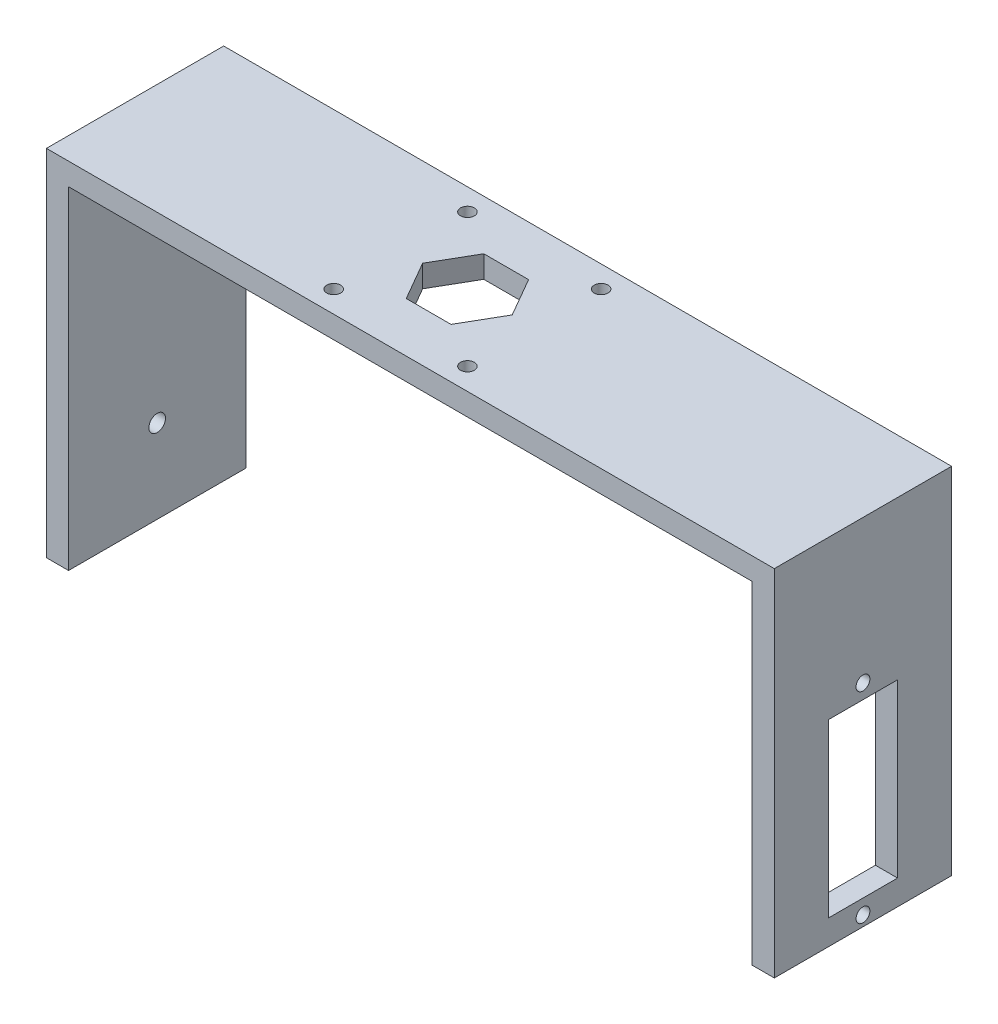
ISO-10303-21;
HEADER;
FILE_DESCRIPTION(('STEP AP214'),'2;1');
FILE_NAME('part.step','',(''),(''),'','','');
FILE_SCHEMA(('AUTOMOTIVE_DESIGN { 1 0 10303 214 1 1 1 1 }'));
ENDSEC;
DATA;
#1=APPLICATION_CONTEXT('core data for automotive mechanical design processes');
#2=APPLICATION_PROTOCOL_DEFINITION('international standard','automotive_design',2000,#1);
#3=PRODUCT_CONTEXT('',#1,'mechanical');
#4=PRODUCT('Part','Part','',(#3));
#5=PRODUCT_RELATED_PRODUCT_CATEGORY('part','',(#4));
#6=PRODUCT_DEFINITION_FORMATION('','',#4);
#7=PRODUCT_DEFINITION_CONTEXT('part definition',#1,'design');
#8=PRODUCT_DEFINITION('design','',#6,#7);
#9=PRODUCT_DEFINITION_SHAPE('','',#8);
#10=(LENGTH_UNIT() NAMED_UNIT(*) SI_UNIT(.MILLI.,.METRE.));
#11=(NAMED_UNIT(*) PLANE_ANGLE_UNIT() SI_UNIT($,.RADIAN.));
#12=(NAMED_UNIT(*) SI_UNIT($,.STERADIAN.) SOLID_ANGLE_UNIT());
#13=UNCERTAINTY_MEASURE_WITH_UNIT(LENGTH_MEASURE(1.E-05),#10,'distance_accuracy_value','');
#14=(GEOMETRIC_REPRESENTATION_CONTEXT(3) GLOBAL_UNCERTAINTY_ASSIGNED_CONTEXT((#13)) GLOBAL_UNIT_ASSIGNED_CONTEXT((#10,
#11,#12)) REPRESENTATION_CONTEXT('',''));
#15=CARTESIAN_POINT('',(0.,0.,0.));
#16=DIRECTION('',(0.,0.,1.));
#17=DIRECTION('',(1.,0.,0.));
#18=AXIS2_PLACEMENT_3D('',#15,#16,#17);
#19=CARTESIAN_POINT('',(67.4,0.,16.));
#20=DIRECTION('',(1.,0.,0.));
#21=DIRECTION('',(0.,0.,-1.));
#22=AXIS2_PLACEMENT_3D('',#19,#20,#21);
#23=PLANE('',#22);
#24=CARTESIAN_POINT('',(67.4,1.87500000000002,0.));
#25=DIRECTION('',(1.,0.,0.));
#26=DIRECTION('',(0.,0.,-1.));
#27=AXIS2_PLACEMENT_3D('',#24,#25,#26);
#28=CIRCLE('',#27,1.25);
#29=CARTESIAN_POINT('',(67.4,1.87500000000002,-1.25));
#30=VERTEX_POINT('',#29);
#31=EDGE_CURVE('E212',#30,#30,#28,.F.);
#32=ORIENTED_EDGE('',*,*,#31,.F.);
#33=EDGE_LOOP('',(#32));
#34=FACE_BOUND('',#33,.T.);
#35=DIRECTION('',(0.,0.,-1.));
#36=VECTOR('',#35,1.);
#37=CARTESIAN_POINT('',(67.4,4.50000000000002,-6.25));
#38=LINE('',#37,#36);
#39=CARTESIAN_POINT('',(67.4,4.50000000000002,6.25));
#40=VERTEX_POINT('',#39);
#41=CARTESIAN_POINT('',(67.4,4.50000000000002,-6.25));
#42=VERTEX_POINT('',#41);
#43=EDGE_CURVE('E222',#40,#42,#38,.T.);
#44=ORIENTED_EDGE('',*,*,#43,.T.);
#45=DIRECTION('',(0.,-1.,0.));
#46=VECTOR('',#45,1.);
#47=CARTESIAN_POINT('',(67.4,4.50000000000006,-6.25));
#48=LINE('',#47,#46);
#49=CARTESIAN_POINT('',(67.4,35.5,-6.25));
#50=VERTEX_POINT('',#49);
#51=EDGE_CURVE('E225',#50,#42,#48,.T.);
#52=ORIENTED_EDGE('',*,*,#51,.F.);
#53=DIRECTION('',(0.,0.,-1.));
#54=VECTOR('',#53,1.);
#55=CARTESIAN_POINT('',(67.4,35.5,-6.25));
#56=LINE('',#55,#54);
#57=CARTESIAN_POINT('',(67.4,35.5,6.25));
#58=VERTEX_POINT('',#57);
#59=EDGE_CURVE('E229',#58,#50,#56,.T.);
#60=ORIENTED_EDGE('',*,*,#59,.F.);
#61=DIRECTION('',(0.,-1.,0.));
#62=VECTOR('',#61,1.);
#63=CARTESIAN_POINT('',(67.4,4.50000000000005,6.25));
#64=LINE('',#63,#62);
#65=EDGE_CURVE('E245',#58,#40,#64,.T.);
#66=ORIENTED_EDGE('',*,*,#65,.T.);
#67=EDGE_LOOP('',(#44,#52,#60,#66));
#68=FACE_BOUND('',#67,.T.);
#69=DIRECTION('',(0.,-1.,0.));
#70=VECTOR('',#69,1.);
#71=CARTESIAN_POINT('',(67.4,0.,-16.));
#72=LINE('',#71,#70);
#73=CARTESIAN_POINT('',(67.4,60.,-16.));
#74=VERTEX_POINT('',#73);
#75=CARTESIAN_POINT('',(67.4,0.,-16.));
#76=VERTEX_POINT('',#75);
#77=EDGE_CURVE('E282',#74,#76,#72,.T.);
#78=ORIENTED_EDGE('',*,*,#77,.T.);
#79=DIRECTION('',(0.,0.,-1.));
#80=VECTOR('',#79,1.);
#81=CARTESIAN_POINT('',(67.4,0.,16.));
#82=LINE('',#81,#80);
#83=CARTESIAN_POINT('',(67.4,0.,16.));
#84=VERTEX_POINT('',#83);
#85=EDGE_CURVE('E302',#84,#76,#82,.T.);
#86=ORIENTED_EDGE('',*,*,#85,.F.);
#87=DIRECTION('',(0.,-1.,0.));
#88=VECTOR('',#87,1.);
#89=CARTESIAN_POINT('',(67.4,0.,16.));
#90=LINE('',#89,#88);
#91=CARTESIAN_POINT('',(67.4,60.,16.));
#92=VERTEX_POINT('',#91);
#93=EDGE_CURVE('E265',#92,#84,#90,.T.);
#94=ORIENTED_EDGE('',*,*,#93,.F.);
#95=DIRECTION('',(0.,0.,-1.));
#96=VECTOR('',#95,1.);
#97=CARTESIAN_POINT('',(67.4,60.,16.));
#98=LINE('',#97,#96);
#99=EDGE_CURVE('E305',#92,#74,#98,.T.);
#100=ORIENTED_EDGE('',*,*,#99,.T.);
#101=EDGE_LOOP('',(#78,#86,#94,#100));
#102=FACE_BOUND('',#101,.T.);
#103=CARTESIAN_POINT('',(67.4,38.125,0.));
#104=DIRECTION('',(1.,0.,0.));
#105=DIRECTION('',(0.,0.,-1.));
#106=AXIS2_PLACEMENT_3D('',#103,#104,#105);
#107=CIRCLE('',#106,1.25);
#108=CARTESIAN_POINT('',(67.4,38.125,-1.25));
#109=VERTEX_POINT('',#108);
#110=EDGE_CURVE('E216',#109,#109,#107,.T.);
#111=ORIENTED_EDGE('',*,*,#110,.T.);
#112=EDGE_LOOP('',(#111));
#113=FACE_BOUND('',#112,.T.);
#114=ADVANCED_FACE('F33',(#34,#68,#102,#113),#23,.F.);
#115=CARTESIAN_POINT('',(71.4,64.,16.));
#116=DIRECTION('',(-1.,0.,0.));
#117=DIRECTION('',(0.,-1.,0.));
#118=AXIS2_PLACEMENT_3D('',#115,#116,#117);
#119=PLANE('',#118);
#120=CARTESIAN_POINT('',(71.4,1.87500000000002,0.));
#121=DIRECTION('',(1.,0.,0.));
#122=DIRECTION('',(0.,1.,0.));
#123=AXIS2_PLACEMENT_3D('',#120,#121,#122);
#124=CIRCLE('',#123,1.25);
#125=CARTESIAN_POINT('',(71.4,3.12500000000002,0.));
#126=VERTEX_POINT('',#125);
#127=EDGE_CURVE('E213',#126,#126,#124,.T.);
#128=ORIENTED_EDGE('',*,*,#127,.F.);
#129=EDGE_LOOP('',(#128));
#130=FACE_BOUND('',#129,.T.);
#131=DIRECTION('',(0.,0.,1.));
#132=VECTOR('',#131,1.);
#133=CARTESIAN_POINT('',(71.4,4.50000000000002,-6.25));
#134=LINE('',#133,#132);
#135=CARTESIAN_POINT('',(71.4,4.50000000000002,-6.25));
#136=VERTEX_POINT('',#135);
#137=CARTESIAN_POINT('',(71.4,4.50000000000002,6.25));
#138=VERTEX_POINT('',#137);
#139=EDGE_CURVE('E242',#136,#138,#134,.T.);
#140=ORIENTED_EDGE('',*,*,#139,.T.);
#141=DIRECTION('',(0.,1.,0.));
#142=VECTOR('',#141,1.);
#143=CARTESIAN_POINT('',(71.4,4.50000000000002,6.25));
#144=LINE('',#143,#142);
#145=CARTESIAN_POINT('',(71.4,35.5,6.25));
#146=VERTEX_POINT('',#145);
#147=EDGE_CURVE('E237',#138,#146,#144,.T.);
#148=ORIENTED_EDGE('',*,*,#147,.T.);
#149=DIRECTION('',(0.,0.,1.));
#150=VECTOR('',#149,1.);
#151=CARTESIAN_POINT('',(71.4,35.5,-6.25));
#152=LINE('',#151,#150);
#153=CARTESIAN_POINT('',(71.4,35.5,-6.25));
#154=VERTEX_POINT('',#153);
#155=EDGE_CURVE('E233',#154,#146,#152,.T.);
#156=ORIENTED_EDGE('',*,*,#155,.F.);
#157=DIRECTION('',(0.,1.,0.));
#158=VECTOR('',#157,1.);
#159=CARTESIAN_POINT('',(71.4,4.50000000000002,-6.25));
#160=LINE('',#159,#158);
#161=EDGE_CURVE('E230',#136,#154,#160,.T.);
#162=ORIENTED_EDGE('',*,*,#161,.F.);
#163=EDGE_LOOP('',(#140,#148,#156,#162));
#164=FACE_BOUND('',#163,.T.);
#165=DIRECTION('',(0.,1.,0.));
#166=VECTOR('',#165,1.);
#167=CARTESIAN_POINT('',(71.4,64.,-16.));
#168=LINE('',#167,#166);
#169=CARTESIAN_POINT('',(71.4,0.,-16.));
#170=VERTEX_POINT('',#169);
#171=CARTESIAN_POINT('',(71.4,64.,-16.));
#172=VERTEX_POINT('',#171);
#173=EDGE_CURVE('E286',#170,#172,#168,.T.);
#174=ORIENTED_EDGE('',*,*,#173,.T.);
#175=DIRECTION('',(0.,0.,-1.));
#176=VECTOR('',#175,1.);
#177=CARTESIAN_POINT('',(71.4,64.,16.));
#178=LINE('',#177,#176);
#179=CARTESIAN_POINT('',(71.4,64.,16.));
#180=VERTEX_POINT('',#179);
#181=EDGE_CURVE('E296',#180,#172,#178,.T.);
#182=ORIENTED_EDGE('',*,*,#181,.F.);
#183=DIRECTION('',(0.,1.,0.));
#184=VECTOR('',#183,1.);
#185=CARTESIAN_POINT('',(71.4,64.,16.));
#186=LINE('',#185,#184);
#187=CARTESIAN_POINT('',(71.4,0.,16.));
#188=VERTEX_POINT('',#187);
#189=EDGE_CURVE('E269',#188,#180,#186,.T.);
#190=ORIENTED_EDGE('',*,*,#189,.F.);
#191=DIRECTION('',(0.,0.,-1.));
#192=VECTOR('',#191,1.);
#193=CARTESIAN_POINT('',(71.4,0.,16.));
#194=LINE('',#193,#192);
#195=EDGE_CURVE('E299',#188,#170,#194,.T.);
#196=ORIENTED_EDGE('',*,*,#195,.T.);
#197=EDGE_LOOP('',(#174,#182,#190,#196));
#198=FACE_BOUND('',#197,.T.);
#199=CARTESIAN_POINT('',(71.4,38.125,0.));
#200=DIRECTION('',(-1.,0.,0.));
#201=DIRECTION('',(0.,-1.,0.));
#202=AXIS2_PLACEMENT_3D('',#199,#200,#201);
#203=CIRCLE('',#202,1.25);
#204=CARTESIAN_POINT('',(71.4,36.875,0.));
#205=VERTEX_POINT('',#204);
#206=EDGE_CURVE('E219',#205,#205,#203,.T.);
#207=ORIENTED_EDGE('',*,*,#206,.T.);
#208=EDGE_LOOP('',(#207));
#209=FACE_BOUND('',#208,.T.);
#210=ADVANCED_FACE('F346',(#130,#164,#198,#209),#119,.F.);
#211=CARTESIAN_POINT('',(-60.,0.,16.));
#212=DIRECTION('',(0.,1.,0.));
#213=DIRECTION('',(0.,0.,1.));
#214=AXIS2_PLACEMENT_3D('',#211,#212,#213);
#215=PLANE('',#214);
#216=DIRECTION('',(1.,0.,0.));
#217=VECTOR('',#216,1.);
#218=CARTESIAN_POINT('',(-60.,0.,-16.));
#219=LINE('',#218,#217);
#220=CARTESIAN_POINT('',(-60.,0.,-16.));
#221=VERTEX_POINT('',#220);
#222=CARTESIAN_POINT('',(-56.,0.,-16.));
#223=VERTEX_POINT('',#222);
#224=EDGE_CURVE('E228',#221,#223,#219,.T.);
#225=ORIENTED_EDGE('',*,*,#224,.T.);
#226=DIRECTION('',(0.,0.,-1.));
#227=VECTOR('',#226,1.);
#228=CARTESIAN_POINT('',(-56.,0.,16.));
#229=LINE('',#228,#227);
#230=CARTESIAN_POINT('',(-56.,0.,16.));
#231=VERTEX_POINT('',#230);
#232=EDGE_CURVE('E11',#231,#223,#229,.T.);
#233=ORIENTED_EDGE('',*,*,#232,.F.);
#234=DIRECTION('',(1.,0.,0.));
#235=VECTOR('',#234,1.);
#236=CARTESIAN_POINT('',(-60.,0.,16.));
#237=LINE('',#236,#235);
#238=CARTESIAN_POINT('',(-60.,0.,16.));
#239=VERTEX_POINT('',#238);
#240=EDGE_CURVE('E257',#239,#231,#237,.T.);
#241=ORIENTED_EDGE('',*,*,#240,.F.);
#242=DIRECTION('',(0.,0.,-1.));
#243=VECTOR('',#242,1.);
#244=CARTESIAN_POINT('',(-60.,0.,16.));
#245=LINE('',#244,#243);
#246=EDGE_CURVE('E275',#239,#221,#245,.T.);
#247=ORIENTED_EDGE('',*,*,#246,.T.);
#248=EDGE_LOOP('',(#225,#233,#241,#247));
#249=FACE_BOUND('',#248,.T.);
#250=ADVANCED_FACE('F35',(#249),#215,.F.);
#251=CARTESIAN_POINT('',(-56.,0.,16.));
#252=DIRECTION('',(-1.,0.,0.));
#253=DIRECTION('',(0.,0.,1.));
#254=AXIS2_PLACEMENT_3D('',#251,#252,#253);
#255=PLANE('',#254);
#256=CARTESIAN_POINT('',(-56.,15.0750000000001,0.));
#257=DIRECTION('',(-1.,0.,0.));
#258=DIRECTION('',(0.,0.,1.));
#259=AXIS2_PLACEMENT_3D('',#256,#257,#258);
#260=CIRCLE('',#259,1.5);
#261=CARTESIAN_POINT('',(-56.,15.0750000000001,1.5));
#262=VERTEX_POINT('',#261);
#263=EDGE_CURVE('E209',#262,#262,#260,.T.);
#264=ORIENTED_EDGE('',*,*,#263,.T.);
#265=EDGE_LOOP('',(#264));
#266=FACE_BOUND('',#265,.T.);
#267=DIRECTION('',(0.,1.,0.));
#268=VECTOR('',#267,1.);
#269=CARTESIAN_POINT('',(-56.,0.,-16.));
#270=LINE('',#269,#268);
#271=CARTESIAN_POINT('',(-56.,60.,-16.));
#272=VERTEX_POINT('',#271);
#273=EDGE_CURVE('E278',#223,#272,#270,.T.);
#274=ORIENTED_EDGE('',*,*,#273,.T.);
#275=DIRECTION('',(0.,0.,-1.));
#276=VECTOR('',#275,1.);
#277=CARTESIAN_POINT('',(-56.,60.,16.));
#278=LINE('',#277,#276);
#279=CARTESIAN_POINT('',(-56.,60.,16.));
#280=VERTEX_POINT('',#279);
#281=EDGE_CURVE('E41',#280,#272,#278,.T.);
#282=ORIENTED_EDGE('',*,*,#281,.F.);
#283=DIRECTION('',(0.,1.,0.));
#284=VECTOR('',#283,1.);
#285=CARTESIAN_POINT('',(-56.,0.,16.));
#286=LINE('',#285,#284);
#287=EDGE_CURVE('E260',#231,#280,#286,.T.);
#288=ORIENTED_EDGE('',*,*,#287,.F.);
#289=ORIENTED_EDGE('',*,*,#232,.T.);
#290=EDGE_LOOP('',(#274,#282,#288,#289));
#291=FACE_BOUND('',#290,.T.);
#292=ADVANCED_FACE('F333',(#266,#291),#255,.F.);
#293=CARTESIAN_POINT('',(-56.,60.,16.));
#294=DIRECTION('',(0.,1.,0.));
#295=DIRECTION('',(0.,0.,1.));
#296=AXIS2_PLACEMENT_3D('',#293,#294,#295);
#297=PLANE('',#296);
#298=CARTESIAN_POINT('',(-12.0703127548544,60.,12.0703127548544));
#299=DIRECTION('',(0.,1.,0.));
#300=DIRECTION('',(0.,0.,1.));
#301=AXIS2_PLACEMENT_3D('',#298,#299,#300);
#302=CIRCLE('',#301,1.25);
#303=CARTESIAN_POINT('',(-12.0703127548544,60.,13.3203127548544));
#304=VERTEX_POINT('',#303);
#305=EDGE_CURVE('E492',#304,#304,#302,.F.);
#306=ORIENTED_EDGE('',*,*,#305,.F.);
#307=EDGE_LOOP('',(#306));
#308=FACE_BOUND('',#307,.T.);
#309=CARTESIAN_POINT('',(12.0703127548544,60.,12.0703127548544));
#310=DIRECTION('',(0.,1.,0.));
#311=DIRECTION('',(0.,0.,1.));
#312=AXIS2_PLACEMENT_3D('',#309,#310,#311);
#313=CIRCLE('',#312,1.25);
#314=CARTESIAN_POINT('',(12.0703127548544,60.,13.3203127548544));
#315=VERTEX_POINT('',#314);
#316=EDGE_CURVE('E488',#315,#315,#313,.F.);
#317=ORIENTED_EDGE('',*,*,#316,.F.);
#318=EDGE_LOOP('',(#317));
#319=FACE_BOUND('',#318,.T.);
#320=CARTESIAN_POINT('',(12.0703127548544,60.,-12.0703127548544));
#321=DIRECTION('',(0.,1.,0.));
#322=DIRECTION('',(0.,0.,1.));
#323=AXIS2_PLACEMENT_3D('',#320,#321,#322);
#324=CIRCLE('',#323,1.25);
#325=CARTESIAN_POINT('',(12.0703127548544,60.,-10.8203127548544));
#326=VERTEX_POINT('',#325);
#327=EDGE_CURVE('E483',#326,#326,#324,.F.);
#328=ORIENTED_EDGE('',*,*,#327,.F.);
#329=EDGE_LOOP('',(#328));
#330=FACE_BOUND('',#329,.T.);
#331=CARTESIAN_POINT('',(-12.0703127548544,60.,-12.0703127548544));
#332=DIRECTION('',(0.,1.,0.));
#333=DIRECTION('',(0.,0.,1.));
#334=AXIS2_PLACEMENT_3D('',#331,#332,#333);
#335=CIRCLE('',#334,1.25);
#336=CARTESIAN_POINT('',(-12.0703127548544,60.,-10.8203127548544));
#337=VERTEX_POINT('',#336);
#338=EDGE_CURVE('E448',#337,#337,#335,.F.);
#339=ORIENTED_EDGE('',*,*,#338,.F.);
#340=EDGE_LOOP('',(#339));
#341=FACE_BOUND('',#340,.T.);
#342=DIRECTION('',(-0.5,0.,-0.866025403784439));
#343=VECTOR('',#342,1.);
#344=CARTESIAN_POINT('',(-8.08290376865477,60.,0.));
#345=LINE('',#344,#343);
#346=CARTESIAN_POINT('',(-4.04145188432739,60.,7.));
#347=VERTEX_POINT('',#346);
#348=CARTESIAN_POINT('',(-8.08290376865477,60.,0.));
#349=VERTEX_POINT('',#348);
#350=EDGE_CURVE('E179',#347,#349,#345,.T.);
#351=ORIENTED_EDGE('',*,*,#350,.F.);
#352=DIRECTION('',(-1.,0.,0.));
#353=VECTOR('',#352,1.);
#354=CARTESIAN_POINT('',(-4.04145188432739,60.,7.));
#355=LINE('',#354,#353);
#356=CARTESIAN_POINT('',(4.04145188432737,60.,7.));
#357=VERTEX_POINT('',#356);
#358=EDGE_CURVE('E160',#357,#347,#355,.T.);
#359=ORIENTED_EDGE('',*,*,#358,.F.);
#360=DIRECTION('',(-0.5,0.,0.866025403784439));
#361=VECTOR('',#360,1.);
#362=CARTESIAN_POINT('',(4.04145188432737,60.,7.));
#363=LINE('',#362,#361);
#364=CARTESIAN_POINT('',(8.08290376865474,60.,0.));
#365=VERTEX_POINT('',#364);
#366=EDGE_CURVE('E169',#365,#357,#363,.T.);
#367=ORIENTED_EDGE('',*,*,#366,.F.);
#368=DIRECTION('',(0.5,0.,0.866025403784439));
#369=VECTOR('',#368,1.);
#370=CARTESIAN_POINT('',(8.08290376865475,60.,0.));
#371=LINE('',#370,#369);
#372=CARTESIAN_POINT('',(4.04145188432737,60.,-7.));
#373=VERTEX_POINT('',#372);
#374=EDGE_CURVE('E48',#373,#365,#371,.T.);
#375=ORIENTED_EDGE('',*,*,#374,.F.);
#376=DIRECTION('',(1.,0.,0.));
#377=VECTOR('',#376,1.);
#378=CARTESIAN_POINT('',(4.04145188432737,60.,-7.));
#379=LINE('',#378,#377);
#380=CARTESIAN_POINT('',(-4.04145188432739,60.,-7.));
#381=VERTEX_POINT('',#380);
#382=EDGE_CURVE('E444',#381,#373,#379,.T.);
#383=ORIENTED_EDGE('',*,*,#382,.F.);
#384=DIRECTION('',(0.5,0.,-0.866025403784439));
#385=VECTOR('',#384,1.);
#386=CARTESIAN_POINT('',(-4.04145188432739,60.,-7.));
#387=LINE('',#386,#385);
#388=EDGE_CURVE('E183',#349,#381,#387,.T.);
#389=ORIENTED_EDGE('',*,*,#388,.F.);
#390=EDGE_LOOP('',(#351,#359,#367,#375,#383,#389));
#391=FACE_BOUND('',#390,.T.);
#392=DIRECTION('',(1.,0.,0.));
#393=VECTOR('',#392,1.);
#394=CARTESIAN_POINT('',(-56.,60.,-16.));
#395=LINE('',#394,#393);
#396=EDGE_CURVE('E280',#272,#74,#395,.T.);
#397=ORIENTED_EDGE('',*,*,#396,.T.);
#398=ORIENTED_EDGE('',*,*,#99,.F.);
#399=DIRECTION('',(1.,0.,0.));
#400=VECTOR('',#399,1.);
#401=CARTESIAN_POINT('',(-56.,60.,16.));
#402=LINE('',#401,#400);
#403=EDGE_CURVE('E263',#280,#92,#402,.T.);
#404=ORIENTED_EDGE('',*,*,#403,.F.);
#405=ORIENTED_EDGE('',*,*,#281,.T.);
#406=EDGE_LOOP('',(#397,#398,#404,#405));
#407=FACE_BOUND('',#406,.T.);
#408=ADVANCED_FACE('F175',(#308,#319,#330,#341,#391,#407),#297,.F.);
#409=CARTESIAN_POINT('',(71.4,0.,16.));
#410=DIRECTION('',(0.,1.,0.));
#411=DIRECTION('',(-1.,0.,0.));
#412=AXIS2_PLACEMENT_3D('',#409,#410,#411);
#413=PLANE('',#412);
#414=DIRECTION('',(1.,0.,0.));
#415=VECTOR('',#414,1.);
#416=CARTESIAN_POINT('',(71.4,0.,-16.));
#417=LINE('',#416,#415);
#418=EDGE_CURVE('E284',#76,#170,#417,.T.);
#419=ORIENTED_EDGE('',*,*,#418,.T.);
#420=ORIENTED_EDGE('',*,*,#195,.F.);
#421=DIRECTION('',(1.,0.,0.));
#422=VECTOR('',#421,1.);
#423=CARTESIAN_POINT('',(71.4,0.,16.));
#424=LINE('',#423,#422);
#425=EDGE_CURVE('E267',#84,#188,#424,.T.);
#426=ORIENTED_EDGE('',*,*,#425,.F.);
#427=ORIENTED_EDGE('',*,*,#85,.T.);
#428=EDGE_LOOP('',(#419,#420,#426,#427));
#429=FACE_BOUND('',#428,.T.);
#430=ADVANCED_FACE('F325',(#429),#413,.F.);
#431=CARTESIAN_POINT('',(71.4,64.,16.));
#432=DIRECTION('',(0.,-1.,0.));
#433=DIRECTION('',(1.,0.,0.));
#434=AXIS2_PLACEMENT_3D('',#431,#432,#433);
#435=PLANE('',#434);
#436=CARTESIAN_POINT('',(-12.0703127548544,64.,12.0703127548544));
#437=DIRECTION('',(0.,1.,0.));
#438=DIRECTION('',(0.,0.,1.));
#439=AXIS2_PLACEMENT_3D('',#436,#437,#438);
#440=CIRCLE('',#439,1.25);
#441=CARTESIAN_POINT('',(-12.0703127548544,64.,13.3203127548544));
#442=VERTEX_POINT('',#441);
#443=EDGE_CURVE('E423',#442,#442,#440,.T.);
#444=ORIENTED_EDGE('',*,*,#443,.F.);
#445=EDGE_LOOP('',(#444));
#446=FACE_BOUND('',#445,.T.);
#447=CARTESIAN_POINT('',(12.0703127548544,64.,12.0703127548544));
#448=DIRECTION('',(0.,1.,0.));
#449=DIRECTION('',(0.,0.,1.));
#450=AXIS2_PLACEMENT_3D('',#447,#448,#449);
#451=CIRCLE('',#450,1.25);
#452=CARTESIAN_POINT('',(12.0703127548544,64.,13.3203127548544));
#453=VERTEX_POINT('',#452);
#454=EDGE_CURVE('E427',#453,#453,#451,.T.);
#455=ORIENTED_EDGE('',*,*,#454,.F.);
#456=EDGE_LOOP('',(#455));
#457=FACE_BOUND('',#456,.T.);
#458=CARTESIAN_POINT('',(12.0703127548544,64.,-12.0703127548544));
#459=DIRECTION('',(0.,1.,0.));
#460=DIRECTION('',(0.,0.,1.));
#461=AXIS2_PLACEMENT_3D('',#458,#459,#460);
#462=CIRCLE('',#461,1.25);
#463=CARTESIAN_POINT('',(12.0703127548544,64.,-10.8203127548544));
#464=VERTEX_POINT('',#463);
#465=EDGE_CURVE('E431',#464,#464,#462,.T.);
#466=ORIENTED_EDGE('',*,*,#465,.F.);
#467=EDGE_LOOP('',(#466));
#468=FACE_BOUND('',#467,.T.);
#469=CARTESIAN_POINT('',(-12.0703127548544,64.,-12.0703127548544));
#470=DIRECTION('',(0.,1.,0.));
#471=DIRECTION('',(0.,0.,1.));
#472=AXIS2_PLACEMENT_3D('',#469,#470,#471);
#473=CIRCLE('',#472,1.25);
#474=CARTESIAN_POINT('',(-12.0703127548544,64.,-10.8203127548544));
#475=VERTEX_POINT('',#474);
#476=EDGE_CURVE('E435',#475,#475,#473,.T.);
#477=ORIENTED_EDGE('',*,*,#476,.F.);
#478=EDGE_LOOP('',(#477));
#479=FACE_BOUND('',#478,.T.);
#480=DIRECTION('',(0.5,0.,-0.866025403784439));
#481=VECTOR('',#480,1.);
#482=CARTESIAN_POINT('',(4.04145188432737,64.,7.));
#483=LINE('',#482,#481);
#484=CARTESIAN_POINT('',(4.04145188432739,64.,7.));
#485=VERTEX_POINT('',#484);
#486=CARTESIAN_POINT('',(8.08290376865475,64.,0.));
#487=VERTEX_POINT('',#486);
#488=EDGE_CURVE('E181',#485,#487,#483,.T.);
#489=ORIENTED_EDGE('',*,*,#488,.F.);
#490=DIRECTION('',(1.,0.,0.));
#491=VECTOR('',#490,1.);
#492=CARTESIAN_POINT('',(-4.04145188432739,64.,7.));
#493=LINE('',#492,#491);
#494=CARTESIAN_POINT('',(-4.04145188432739,64.,7.));
#495=VERTEX_POINT('',#494);
#496=EDGE_CURVE('E56',#495,#485,#493,.T.);
#497=ORIENTED_EDGE('',*,*,#496,.F.);
#498=DIRECTION('',(0.5,0.,0.866025403784439));
#499=VECTOR('',#498,1.);
#500=CARTESIAN_POINT('',(-8.08290376865477,64.,0.));
#501=LINE('',#500,#499);
#502=CARTESIAN_POINT('',(-8.08290376865477,64.,0.));
#503=VERTEX_POINT('',#502);
#504=EDGE_CURVE('E166',#503,#495,#501,.T.);
#505=ORIENTED_EDGE('',*,*,#504,.F.);
#506=DIRECTION('',(-0.5,0.,0.866025403784439));
#507=VECTOR('',#506,1.);
#508=CARTESIAN_POINT('',(-4.04145188432739,64.,-7.));
#509=LINE('',#508,#507);
#510=CARTESIAN_POINT('',(-4.04145188432739,64.,-7.));
#511=VERTEX_POINT('',#510);
#512=EDGE_CURVE('E194',#511,#503,#509,.T.);
#513=ORIENTED_EDGE('',*,*,#512,.F.);
#514=DIRECTION('',(-1.,0.,0.));
#515=VECTOR('',#514,1.);
#516=CARTESIAN_POINT('',(4.04145188432737,64.,-7.));
#517=LINE('',#516,#515);
#518=CARTESIAN_POINT('',(4.04145188432737,64.,-7.));
#519=VERTEX_POINT('',#518);
#520=EDGE_CURVE('E191',#519,#511,#517,.T.);
#521=ORIENTED_EDGE('',*,*,#520,.F.);
#522=DIRECTION('',(-0.5,0.,-0.866025403784438));
#523=VECTOR('',#522,1.);
#524=CARTESIAN_POINT('',(8.08290376865475,64.,0.));
#525=LINE('',#524,#523);
#526=EDGE_CURVE('E188',#487,#519,#525,.T.);
#527=ORIENTED_EDGE('',*,*,#526,.F.);
#528=EDGE_LOOP('',(#489,#497,#505,#513,#521,#527));
#529=FACE_BOUND('',#528,.T.);
#530=DIRECTION('',(-1.,0.,0.));
#531=VECTOR('',#530,1.);
#532=CARTESIAN_POINT('',(71.4,64.,-16.));
#533=LINE('',#532,#531);
#534=CARTESIAN_POINT('',(-60.,64.,-16.));
#535=VERTEX_POINT('',#534);
#536=EDGE_CURVE('E288',#172,#535,#533,.T.);
#537=ORIENTED_EDGE('',*,*,#536,.T.);
#538=DIRECTION('',(0.,0.,-1.));
#539=VECTOR('',#538,1.);
#540=CARTESIAN_POINT('',(-60.,64.,16.));
#541=LINE('',#540,#539);
#542=CARTESIAN_POINT('',(-60.,64.,16.));
#543=VERTEX_POINT('',#542);
#544=EDGE_CURVE('E293',#543,#535,#541,.T.);
#545=ORIENTED_EDGE('',*,*,#544,.F.);
#546=DIRECTION('',(-1.,0.,0.));
#547=VECTOR('',#546,1.);
#548=CARTESIAN_POINT('',(71.4,64.,16.));
#549=LINE('',#548,#547);
#550=EDGE_CURVE('E271',#180,#543,#549,.T.);
#551=ORIENTED_EDGE('',*,*,#550,.F.);
#552=ORIENTED_EDGE('',*,*,#181,.T.);
#553=EDGE_LOOP('',(#537,#545,#551,#552));
#554=FACE_BOUND('',#553,.T.);
#555=ADVANCED_FACE('F344',(#446,#457,#468,#479,#529,#554),#435,.F.);
#556=CARTESIAN_POINT('',(-60.,64.,16.));
#557=DIRECTION('',(1.,0.,0.));
#558=DIRECTION('',(0.,1.,0.));
#559=AXIS2_PLACEMENT_3D('',#556,#557,#558);
#560=PLANE('',#559);
#561=CARTESIAN_POINT('',(-60.,15.0750000000001,0.));
#562=DIRECTION('',(1.,0.,0.));
#563=DIRECTION('',(0.,1.,0.));
#564=AXIS2_PLACEMENT_3D('',#561,#562,#563);
#565=CIRCLE('',#564,1.5);
#566=CARTESIAN_POINT('',(-60.,16.5750000000001,0.));
#567=VERTEX_POINT('',#566);
#568=EDGE_CURVE('E172',#567,#567,#565,.T.);
#569=ORIENTED_EDGE('',*,*,#568,.T.);
#570=EDGE_LOOP('',(#569));
#571=FACE_BOUND('',#570,.T.);
#572=DIRECTION('',(0.,-1.,0.));
#573=VECTOR('',#572,1.);
#574=CARTESIAN_POINT('',(-60.,64.,-16.));
#575=LINE('',#574,#573);
#576=EDGE_CURVE('E261',#535,#221,#575,.T.);
#577=ORIENTED_EDGE('',*,*,#576,.T.);
#578=ORIENTED_EDGE('',*,*,#246,.F.);
#579=DIRECTION('',(0.,-1.,0.));
#580=VECTOR('',#579,1.);
#581=CARTESIAN_POINT('',(-60.,64.,16.));
#582=LINE('',#581,#580);
#583=EDGE_CURVE('E273',#543,#239,#582,.T.);
#584=ORIENTED_EDGE('',*,*,#583,.F.);
#585=ORIENTED_EDGE('',*,*,#544,.T.);
#586=EDGE_LOOP('',(#577,#578,#584,#585));
#587=FACE_BOUND('',#586,.T.);
#588=ADVANCED_FACE('F339',(#571,#587),#560,.F.);
#589=CARTESIAN_POINT('',(0.,0.,16.));
#590=DIRECTION('',(0.,0.,1.));
#591=DIRECTION('',(1.,0.,0.));
#592=AXIS2_PLACEMENT_3D('',#589,#590,#591);
#593=PLANE('',#592);
#594=ORIENTED_EDGE('',*,*,#240,.T.);
#595=ORIENTED_EDGE('',*,*,#287,.T.);
#596=ORIENTED_EDGE('',*,*,#403,.T.);
#597=ORIENTED_EDGE('',*,*,#93,.T.);
#598=ORIENTED_EDGE('',*,*,#425,.T.);
#599=ORIENTED_EDGE('',*,*,#189,.T.);
#600=ORIENTED_EDGE('',*,*,#550,.T.);
#601=ORIENTED_EDGE('',*,*,#583,.T.);
#602=EDGE_LOOP('',(#594,#595,#596,#597,#598,#599,#600,#601));
#603=FACE_BOUND('',#602,.T.);
#604=ADVANCED_FACE('F329',(#603),#593,.T.);
#605=CARTESIAN_POINT('',(0.,0.,-16.));
#606=DIRECTION('',(0.,0.,1.));
#607=DIRECTION('',(1.,0.,0.));
#608=AXIS2_PLACEMENT_3D('',#605,#606,#607);
#609=PLANE('',#608);
#610=ORIENTED_EDGE('',*,*,#224,.F.);
#611=ORIENTED_EDGE('',*,*,#576,.F.);
#612=ORIENTED_EDGE('',*,*,#536,.F.);
#613=ORIENTED_EDGE('',*,*,#173,.F.);
#614=ORIENTED_EDGE('',*,*,#418,.F.);
#615=ORIENTED_EDGE('',*,*,#77,.F.);
#616=ORIENTED_EDGE('',*,*,#396,.F.);
#617=ORIENTED_EDGE('',*,*,#273,.F.);
#618=EDGE_LOOP('',(#610,#611,#612,#613,#614,#615,#616,#617));
#619=FACE_BOUND('',#618,.T.);
#620=ADVANCED_FACE('F316',(#619),#609,.F.);
#621=CARTESIAN_POINT('',(-60.001,4.50000000000006,-6.25));
#622=DIRECTION('',(0.,1.,0.));
#623=DIRECTION('',(-1.,0.,0.));
#624=AXIS2_PLACEMENT_3D('',#621,#622,#623);
#625=PLANE('',#624);
#626=DIRECTION('',(1.,0.,0.));
#627=VECTOR('',#626,1.);
#628=CARTESIAN_POINT('',(-60.001,4.50000000000005,6.25));
#629=LINE('',#628,#627);
#630=EDGE_CURVE('E241',#40,#138,#629,.T.);
#631=ORIENTED_EDGE('',*,*,#630,.T.);
#632=ORIENTED_EDGE('',*,*,#139,.F.);
#633=DIRECTION('',(1.,0.,0.));
#634=VECTOR('',#633,1.);
#635=CARTESIAN_POINT('',(-60.001,4.50000000000006,-6.25));
#636=LINE('',#635,#634);
#637=EDGE_CURVE('E246',#42,#136,#636,.T.);
#638=ORIENTED_EDGE('',*,*,#637,.F.);
#639=ORIENTED_EDGE('',*,*,#43,.F.);
#640=EDGE_LOOP('',(#631,#632,#638,#639));
#641=FACE_BOUND('',#640,.T.);
#642=ADVANCED_FACE('F403',(#641),#625,.T.);
#643=CARTESIAN_POINT('',(-60.001,4.50000000000005,6.25));
#644=DIRECTION('',(0.,0.,-1.));
#645=DIRECTION('',(0.,1.,0.));
#646=AXIS2_PLACEMENT_3D('',#643,#644,#645);
#647=PLANE('',#646);
#648=DIRECTION('',(1.,0.,0.));
#649=VECTOR('',#648,1.);
#650=CARTESIAN_POINT('',(-60.001,35.5,6.25));
#651=LINE('',#650,#649);
#652=EDGE_CURVE('E240',#58,#146,#651,.T.);
#653=ORIENTED_EDGE('',*,*,#652,.T.);
#654=ORIENTED_EDGE('',*,*,#147,.F.);
#655=ORIENTED_EDGE('',*,*,#630,.F.);
#656=ORIENTED_EDGE('',*,*,#65,.F.);
#657=EDGE_LOOP('',(#653,#654,#655,#656));
#658=FACE_BOUND('',#657,.T.);
#659=ADVANCED_FACE('F399',(#658),#647,.T.);
#660=CARTESIAN_POINT('',(-60.001,35.5,-6.25));
#661=DIRECTION('',(0.,1.,0.));
#662=DIRECTION('',(-1.,0.,0.));
#663=AXIS2_PLACEMENT_3D('',#660,#661,#662);
#664=PLANE('',#663);
#665=ORIENTED_EDGE('',*,*,#59,.T.);
#666=DIRECTION('',(1.,0.,0.));
#667=VECTOR('',#666,1.);
#668=CARTESIAN_POINT('',(-60.001,35.5,-6.25));
#669=LINE('',#668,#667);
#670=EDGE_CURVE('E234',#50,#154,#669,.T.);
#671=ORIENTED_EDGE('',*,*,#670,.T.);
#672=ORIENTED_EDGE('',*,*,#155,.T.);
#673=ORIENTED_EDGE('',*,*,#652,.F.);
#674=EDGE_LOOP('',(#665,#671,#672,#673));
#675=FACE_BOUND('',#674,.T.);
#676=ADVANCED_FACE('F395',(#675),#664,.F.);
#677=CARTESIAN_POINT('',(-60.001,4.50000000000006,-6.25));
#678=DIRECTION('',(0.,0.,-1.));
#679=DIRECTION('',(0.,1.,0.));
#680=AXIS2_PLACEMENT_3D('',#677,#678,#679);
#681=PLANE('',#680);
#682=ORIENTED_EDGE('',*,*,#51,.T.);
#683=ORIENTED_EDGE('',*,*,#637,.T.);
#684=ORIENTED_EDGE('',*,*,#161,.T.);
#685=ORIENTED_EDGE('',*,*,#670,.F.);
#686=EDGE_LOOP('',(#682,#683,#684,#685));
#687=FACE_BOUND('',#686,.T.);
#688=ADVANCED_FACE('F357',(#687),#681,.F.);
#689=CARTESIAN_POINT('',(-60.001,38.125,0.));
#690=DIRECTION('',(1.,0.,0.));
#691=DIRECTION('',(0.,1.,0.));
#692=AXIS2_PLACEMENT_3D('',#689,#690,#691);
#693=CYLINDRICAL_SURFACE('',#692,1.25);
#694=ORIENTED_EDGE('',*,*,#206,.F.);
#695=EDGE_LOOP('',(#694));
#696=FACE_BOUND('',#695,.T.);
#697=ORIENTED_EDGE('',*,*,#110,.F.);
#698=EDGE_LOOP('',(#697));
#699=FACE_BOUND('',#698,.T.);
#700=ADVANCED_FACE('F353',(#696,#699),#693,.F.);
#701=CARTESIAN_POINT('',(-60.001,1.87500000000005,0.));
#702=DIRECTION('',(1.,0.,0.));
#703=DIRECTION('',(0.,1.,0.));
#704=AXIS2_PLACEMENT_3D('',#701,#702,#703);
#705=CYLINDRICAL_SURFACE('',#704,1.25);
#706=ORIENTED_EDGE('',*,*,#127,.T.);
#707=EDGE_LOOP('',(#706));
#708=FACE_BOUND('',#707,.T.);
#709=ORIENTED_EDGE('',*,*,#31,.T.);
#710=EDGE_LOOP('',(#709));
#711=FACE_BOUND('',#710,.T.);
#712=ADVANCED_FACE('F356',(#708,#711),#705,.F.);
#713=CARTESIAN_POINT('',(-60.,15.0750000000001,0.));
#714=DIRECTION('',(1.,0.,0.));
#715=DIRECTION('',(0.,1.,0.));
#716=AXIS2_PLACEMENT_3D('',#713,#714,#715);
#717=CYLINDRICAL_SURFACE('',#716,1.5);
#718=ORIENTED_EDGE('',*,*,#568,.F.);
#719=EDGE_LOOP('',(#718));
#720=FACE_BOUND('',#719,.T.);
#721=ORIENTED_EDGE('',*,*,#263,.F.);
#722=EDGE_LOOP('',(#721));
#723=FACE_BOUND('',#722,.T.);
#724=ADVANCED_FACE('F378',(#720,#723),#717,.F.);
#725=CARTESIAN_POINT('',(-4.04145188432739,-0.001000000000001,7.));
#726=DIRECTION('',(0.,0.,1.));
#727=DIRECTION('',(1.,0.,0.));
#728=AXIS2_PLACEMENT_3D('',#725,#726,#727);
#729=PLANE('',#728);
#730=ORIENTED_EDGE('',*,*,#358,.T.);
#731=DIRECTION('',(0.,1.,0.));
#732=VECTOR('',#731,1.);
#733=CARTESIAN_POINT('',(-4.04145188432739,-0.001000000000001,7.));
#734=LINE('',#733,#732);
#735=EDGE_CURVE('E173',#347,#495,#734,.T.);
#736=ORIENTED_EDGE('',*,*,#735,.T.);
#737=ORIENTED_EDGE('',*,*,#496,.T.);
#738=DIRECTION('',(0.,1.,0.));
#739=VECTOR('',#738,1.);
#740=CARTESIAN_POINT('',(4.04145188432737,-0.001000000000001,7.));
#741=LINE('',#740,#739);
#742=EDGE_CURVE('E156',#357,#485,#741,.T.);
#743=ORIENTED_EDGE('',*,*,#742,.F.);
#744=EDGE_LOOP('',(#730,#736,#737,#743));
#745=FACE_BOUND('',#744,.T.);
#746=ADVANCED_FACE('F158',(#745),#729,.F.);
#747=CARTESIAN_POINT('',(-8.08290376865477,-0.001000000000001,0.));
#748=DIRECTION('',(-0.866025403784439,0.,0.5));
#749=DIRECTION('',(0.5,0.,0.866025403784439));
#750=AXIS2_PLACEMENT_3D('',#747,#748,#749);
#751=PLANE('',#750);
#752=ORIENTED_EDGE('',*,*,#350,.T.);
#753=DIRECTION('',(0.,1.,0.));
#754=VECTOR('',#753,1.);
#755=CARTESIAN_POINT('',(-8.08290376865477,-0.001000000000001,0.));
#756=LINE('',#755,#754);
#757=EDGE_CURVE('E200',#349,#503,#756,.T.);
#758=ORIENTED_EDGE('',*,*,#757,.T.);
#759=ORIENTED_EDGE('',*,*,#504,.T.);
#760=ORIENTED_EDGE('',*,*,#735,.F.);
#761=EDGE_LOOP('',(#752,#758,#759,#760));
#762=FACE_BOUND('',#761,.T.);
#763=ADVANCED_FACE('F386',(#762),#751,.F.);
#764=CARTESIAN_POINT('',(-4.04145188432739,-0.001000000000001,-7.));
#765=DIRECTION('',(-0.866025403784439,0.,-0.5));
#766=DIRECTION('',(-0.5,0.,0.866025403784439));
#767=AXIS2_PLACEMENT_3D('',#764,#765,#766);
#768=PLANE('',#767);
#769=ORIENTED_EDGE('',*,*,#388,.T.);
#770=DIRECTION('',(0.,1.,0.));
#771=VECTOR('',#770,1.);
#772=CARTESIAN_POINT('',(-4.04145188432739,-0.001000000000001,-7.));
#773=LINE('',#772,#771);
#774=EDGE_CURVE('E202',#381,#511,#773,.T.);
#775=ORIENTED_EDGE('',*,*,#774,.T.);
#776=ORIENTED_EDGE('',*,*,#512,.T.);
#777=ORIENTED_EDGE('',*,*,#757,.F.);
#778=EDGE_LOOP('',(#769,#775,#776,#777));
#779=FACE_BOUND('',#778,.T.);
#780=ADVANCED_FACE('F454',(#779),#768,.F.);
#781=CARTESIAN_POINT('',(4.04145188432737,-0.001000000000001,-7.));
#782=DIRECTION('',(0.,0.,-1.));
#783=DIRECTION('',(-1.,0.,0.));
#784=AXIS2_PLACEMENT_3D('',#781,#782,#783);
#785=PLANE('',#784);
#786=ORIENTED_EDGE('',*,*,#382,.T.);
#787=DIRECTION('',(0.,1.,0.));
#788=VECTOR('',#787,1.);
#789=CARTESIAN_POINT('',(4.04145188432737,-0.001000000000001,-7.));
#790=LINE('',#789,#788);
#791=EDGE_CURVE('E204',#373,#519,#790,.T.);
#792=ORIENTED_EDGE('',*,*,#791,.T.);
#793=ORIENTED_EDGE('',*,*,#520,.T.);
#794=ORIENTED_EDGE('',*,*,#774,.F.);
#795=EDGE_LOOP('',(#786,#792,#793,#794));
#796=FACE_BOUND('',#795,.T.);
#797=ADVANCED_FACE('F445',(#796),#785,.F.);
#798=CARTESIAN_POINT('',(8.08290376865475,-0.001000000000001,0.));
#799=DIRECTION('',(0.866025403784438,0.,-0.5));
#800=DIRECTION('',(-0.5,0.,-0.866025403784439));
#801=AXIS2_PLACEMENT_3D('',#798,#799,#800);
#802=PLANE('',#801);
#803=ORIENTED_EDGE('',*,*,#374,.T.);
#804=DIRECTION('',(0.,1.,0.));
#805=VECTOR('',#804,1.);
#806=CARTESIAN_POINT('',(8.08290376865475,-0.001000000000001,0.));
#807=LINE('',#806,#805);
#808=EDGE_CURVE('E165',#365,#487,#807,.T.);
#809=ORIENTED_EDGE('',*,*,#808,.T.);
#810=ORIENTED_EDGE('',*,*,#526,.T.);
#811=ORIENTED_EDGE('',*,*,#791,.F.);
#812=EDGE_LOOP('',(#803,#809,#810,#811));
#813=FACE_BOUND('',#812,.T.);
#814=ADVANCED_FACE('F440',(#813),#802,.F.);
#815=CARTESIAN_POINT('',(4.04145188432737,-0.001000000000001,7.));
#816=DIRECTION('',(0.866025403784439,0.,0.5));
#817=DIRECTION('',(0.5,0.,-0.866025403784439));
#818=AXIS2_PLACEMENT_3D('',#815,#816,#817);
#819=PLANE('',#818);
#820=ORIENTED_EDGE('',*,*,#366,.T.);
#821=ORIENTED_EDGE('',*,*,#742,.T.);
#822=ORIENTED_EDGE('',*,*,#488,.T.);
#823=ORIENTED_EDGE('',*,*,#808,.F.);
#824=EDGE_LOOP('',(#820,#821,#822,#823));
#825=FACE_BOUND('',#824,.T.);
#826=ADVANCED_FACE('F170',(#825),#819,.F.);
#827=CARTESIAN_POINT('',(-12.0703127548544,-0.001000000000001,-12.0703127548544));
#828=DIRECTION('',(0.,1.,0.));
#829=DIRECTION('',(0.,0.,1.));
#830=AXIS2_PLACEMENT_3D('',#827,#828,#829);
#831=CYLINDRICAL_SURFACE('',#830,1.25);
#832=ORIENTED_EDGE('',*,*,#476,.T.);
#833=EDGE_LOOP('',(#832));
#834=FACE_BOUND('',#833,.T.);
#835=ORIENTED_EDGE('',*,*,#338,.T.);
#836=EDGE_LOOP('',(#835));
#837=FACE_BOUND('',#836,.T.);
#838=ADVANCED_FACE('F463',(#834,#837),#831,.F.);
#839=CARTESIAN_POINT('',(12.0703127548544,-0.001000000000001,-12.0703127548544));
#840=DIRECTION('',(0.,1.,0.));
#841=DIRECTION('',(0.,0.,1.));
#842=AXIS2_PLACEMENT_3D('',#839,#840,#841);
#843=CYLINDRICAL_SURFACE('',#842,1.25);
#844=ORIENTED_EDGE('',*,*,#465,.T.);
#845=EDGE_LOOP('',(#844));
#846=FACE_BOUND('',#845,.T.);
#847=ORIENTED_EDGE('',*,*,#327,.T.);
#848=EDGE_LOOP('',(#847));
#849=FACE_BOUND('',#848,.T.);
#850=ADVANCED_FACE('F473',(#846,#849),#843,.F.);
#851=CARTESIAN_POINT('',(12.0703127548544,-0.001000000000001,12.0703127548544));
#852=DIRECTION('',(0.,1.,0.));
#853=DIRECTION('',(0.,0.,1.));
#854=AXIS2_PLACEMENT_3D('',#851,#852,#853);
#855=CYLINDRICAL_SURFACE('',#854,1.25);
#856=ORIENTED_EDGE('',*,*,#454,.T.);
#857=EDGE_LOOP('',(#856));
#858=FACE_BOUND('',#857,.T.);
#859=ORIENTED_EDGE('',*,*,#316,.T.);
#860=EDGE_LOOP('',(#859));
#861=FACE_BOUND('',#860,.T.);
#862=ADVANCED_FACE('F478',(#858,#861),#855,.F.);
#863=CARTESIAN_POINT('',(-12.0703127548544,-0.001000000000001,12.0703127548544));
#864=DIRECTION('',(0.,1.,0.));
#865=DIRECTION('',(0.,0.,1.));
#866=AXIS2_PLACEMENT_3D('',#863,#864,#865);
#867=CYLINDRICAL_SURFACE('',#866,1.25);
#868=ORIENTED_EDGE('',*,*,#443,.T.);
#869=EDGE_LOOP('',(#868));
#870=FACE_BOUND('',#869,.T.);
#871=ORIENTED_EDGE('',*,*,#305,.T.);
#872=EDGE_LOOP('',(#871));
#873=FACE_BOUND('',#872,.T.);
#874=ADVANCED_FACE('F496',(#870,#873),#867,.F.);
#875=CLOSED_SHELL('',(#114,#210,#250,#292,#408,#430,#555,#588,#604,#620,#642,#659,#676,#688,
#700,#712,#724,#746,#763,#780,#797,#814,#826,#838,#850,#862,#874));
#876=MANIFOLD_SOLID_BREP('B2',#875);
#877=ADVANCED_BREP_SHAPE_REPRESENTATION('',(#18,#876),#14);
#878=SHAPE_DEFINITION_REPRESENTATION(#9,#877);
ENDSEC;
END-ISO-10303-21;
